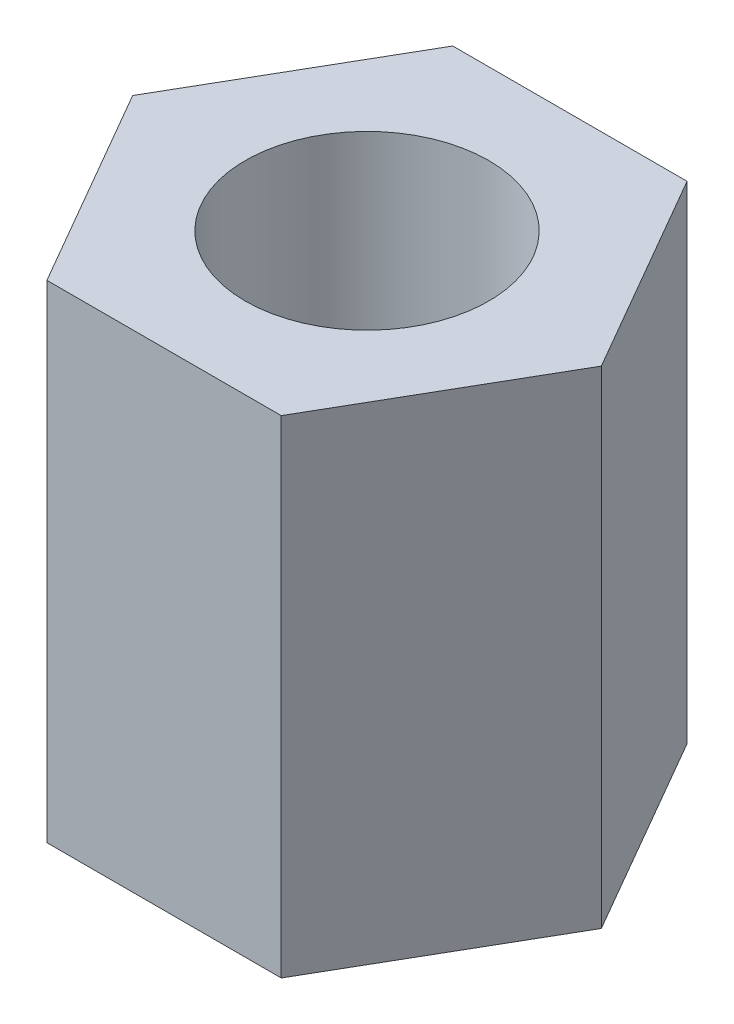
ISO-10303-21;
HEADER;
FILE_DESCRIPTION(('STEP AP214'),'2;1');
FILE_NAME('part.step','',(''),(''),'','','');
FILE_SCHEMA(('AUTOMOTIVE_DESIGN { 1 0 10303 214 1 1 1 1 }'));
ENDSEC;
DATA;
#1=APPLICATION_CONTEXT('core data for automotive mechanical design processes');
#2=APPLICATION_PROTOCOL_DEFINITION('international standard','automotive_design',2000,#1);
#3=PRODUCT_CONTEXT('',#1,'mechanical');
#4=PRODUCT('Part','Part','',(#3));
#5=PRODUCT_RELATED_PRODUCT_CATEGORY('part','',(#4));
#6=PRODUCT_DEFINITION_FORMATION('','',#4);
#7=PRODUCT_DEFINITION_CONTEXT('part definition',#1,'design');
#8=PRODUCT_DEFINITION('design','',#6,#7);
#9=PRODUCT_DEFINITION_SHAPE('','',#8);
#10=(LENGTH_UNIT() NAMED_UNIT(*) SI_UNIT(.MILLI.,.METRE.));
#11=(NAMED_UNIT(*) PLANE_ANGLE_UNIT() SI_UNIT($,.RADIAN.));
#12=(NAMED_UNIT(*) SI_UNIT($,.STERADIAN.) SOLID_ANGLE_UNIT());
#13=UNCERTAINTY_MEASURE_WITH_UNIT(LENGTH_MEASURE(1.E-05),#10,'distance_accuracy_value','');
#14=(GEOMETRIC_REPRESENTATION_CONTEXT(3) GLOBAL_UNCERTAINTY_ASSIGNED_CONTEXT((#13)) GLOBAL_UNIT_ASSIGNED_CONTEXT((#10,
#11,#12)) REPRESENTATION_CONTEXT('',''));
#15=CARTESIAN_POINT('',(0.,0.,0.));
#16=DIRECTION('',(0.,0.,1.));
#17=DIRECTION('',(1.,0.,0.));
#18=AXIS2_PLACEMENT_3D('',#15,#16,#17);
#19=CARTESIAN_POINT('',(0.,3.,0.));
#20=DIRECTION('',(0.,1.,0.));
#21=DIRECTION('',(0.,0.,1.));
#22=AXIS2_PLACEMENT_3D('',#19,#20,#21);
#23=PLANE('',#22);
#24=DIRECTION('',(1.,0.,0.));
#25=VECTOR('',#24,1.);
#26=CARTESIAN_POINT('',(-1.44337567297405,3.,2.5));
#27=LINE('',#26,#25);
#28=CARTESIAN_POINT('',(-1.44337567297405,3.,2.5));
#29=VERTEX_POINT('',#28);
#30=CARTESIAN_POINT('',(1.44337567297408,3.,2.5));
#31=VERTEX_POINT('',#30);
#32=EDGE_CURVE('E128',#29,#31,#27,.T.);
#33=ORIENTED_EDGE('',*,*,#32,.T.);
#34=DIRECTION('',(0.500000000000001,0.,-0.866025403784438));
#35=VECTOR('',#34,1.);
#36=CARTESIAN_POINT('',(1.44337567297408,3.,2.5));
#37=LINE('',#36,#35);
#38=CARTESIAN_POINT('',(2.88675134594815,3.,0.));
#39=VERTEX_POINT('',#38);
#40=EDGE_CURVE('E86',#31,#39,#37,.T.);
#41=ORIENTED_EDGE('',*,*,#40,.T.);
#42=DIRECTION('',(-0.500000000000001,0.,-0.866025403784438));
#43=VECTOR('',#42,1.);
#44=CARTESIAN_POINT('',(2.88675134594815,3.,0.));
#45=LINE('',#44,#43);
#46=CARTESIAN_POINT('',(1.44337567297408,3.,-2.50000000000001));
#47=VERTEX_POINT('',#46);
#48=EDGE_CURVE('E99',#39,#47,#45,.T.);
#49=ORIENTED_EDGE('',*,*,#48,.T.);
#50=DIRECTION('',(-1.,0.,0.));
#51=VECTOR('',#50,1.);
#52=CARTESIAN_POINT('',(1.44337567297408,3.,-2.50000000000001));
#53=LINE('',#52,#51);
#54=CARTESIAN_POINT('',(-1.44337567297405,3.,-2.50000000000001));
#55=VERTEX_POINT('',#54);
#56=EDGE_CURVE('E93',#47,#55,#53,.T.);
#57=ORIENTED_EDGE('',*,*,#56,.T.);
#58=DIRECTION('',(-0.5,0.,0.866025403784438));
#59=VECTOR('',#58,1.);
#60=CARTESIAN_POINT('',(-1.44337567297405,3.,-2.50000000000001));
#61=LINE('',#60,#59);
#62=CARTESIAN_POINT('',(-2.88675134594812,3.,0.));
#63=VERTEX_POINT('',#62);
#64=EDGE_CURVE('E97',#55,#63,#61,.T.);
#65=ORIENTED_EDGE('',*,*,#64,.T.);
#66=DIRECTION('',(0.5,0.,0.866025403784438));
#67=VECTOR('',#66,1.);
#68=CARTESIAN_POINT('',(-2.88675134594812,3.,0.));
#69=LINE('',#68,#67);
#70=EDGE_CURVE('E49',#63,#29,#69,.T.);
#71=ORIENTED_EDGE('',*,*,#70,.T.);
#72=EDGE_LOOP('',(#33,#41,#49,#57,#65,#71));
#73=FACE_BOUND('',#72,.T.);
#74=CARTESIAN_POINT('',(0.,3.,0.));
#75=DIRECTION('',(0.,1.,0.));
#76=DIRECTION('',(0.,0.,1.));
#77=AXIS2_PLACEMENT_3D('',#74,#75,#76);
#78=CIRCLE('',#77,1.5);
#79=CARTESIAN_POINT('',(0.,3.,1.5));
#80=VERTEX_POINT('',#79);
#81=EDGE_CURVE('E121',#80,#80,#78,.T.);
#82=ORIENTED_EDGE('',*,*,#81,.F.);
#83=EDGE_LOOP('',(#82));
#84=FACE_BOUND('',#83,.T.);
#85=ADVANCED_FACE('F32',(#73,#84),#23,.T.);
#86=CARTESIAN_POINT('',(0.,-3.,0.));
#87=DIRECTION('',(0.,1.,0.));
#88=DIRECTION('',(0.,0.,1.));
#89=AXIS2_PLACEMENT_3D('',#86,#87,#88);
#90=PLANE('',#89);
#91=DIRECTION('',(1.,0.,0.));
#92=VECTOR('',#91,1.);
#93=CARTESIAN_POINT('',(-1.44337567297405,-3.,2.5));
#94=LINE('',#93,#92);
#95=CARTESIAN_POINT('',(-1.44337567297405,-3.,2.5));
#96=VERTEX_POINT('',#95);
#97=CARTESIAN_POINT('',(1.44337567297408,-3.,2.5));
#98=VERTEX_POINT('',#97);
#99=EDGE_CURVE('E117',#96,#98,#94,.T.);
#100=ORIENTED_EDGE('',*,*,#99,.F.);
#101=DIRECTION('',(0.5,0.,0.866025403784438));
#102=VECTOR('',#101,1.);
#103=CARTESIAN_POINT('',(-2.88675134594812,-3.,0.));
#104=LINE('',#103,#102);
#105=CARTESIAN_POINT('',(-2.88675134594812,-3.,0.));
#106=VERTEX_POINT('',#105);
#107=EDGE_CURVE('E78',#106,#96,#104,.T.);
#108=ORIENTED_EDGE('',*,*,#107,.F.);
#109=DIRECTION('',(-0.5,0.,0.866025403784438));
#110=VECTOR('',#109,1.);
#111=CARTESIAN_POINT('',(-1.44337567297405,-3.,-2.50000000000001));
#112=LINE('',#111,#110);
#113=CARTESIAN_POINT('',(-1.44337567297405,-3.,-2.50000000000001));
#114=VERTEX_POINT('',#113);
#115=EDGE_CURVE('E72',#114,#106,#112,.T.);
#116=ORIENTED_EDGE('',*,*,#115,.F.);
#117=DIRECTION('',(-1.,0.,0.));
#118=VECTOR('',#117,1.);
#119=CARTESIAN_POINT('',(1.44337567297408,-3.,-2.50000000000001));
#120=LINE('',#119,#118);
#121=CARTESIAN_POINT('',(1.44337567297408,-3.,-2.50000000000001));
#122=VERTEX_POINT('',#121);
#123=EDGE_CURVE('E107',#122,#114,#120,.T.);
#124=ORIENTED_EDGE('',*,*,#123,.F.);
#125=DIRECTION('',(-0.500000000000001,0.,-0.866025403784438));
#126=VECTOR('',#125,1.);
#127=CARTESIAN_POINT('',(2.88675134594815,-3.,0.));
#128=LINE('',#127,#126);
#129=CARTESIAN_POINT('',(2.88675134594815,-3.,0.));
#130=VERTEX_POINT('',#129);
#131=EDGE_CURVE('E123',#130,#122,#128,.T.);
#132=ORIENTED_EDGE('',*,*,#131,.F.);
#133=DIRECTION('',(0.500000000000001,0.,-0.866025403784438));
#134=VECTOR('',#133,1.);
#135=CARTESIAN_POINT('',(1.44337567297408,-3.,2.5));
#136=LINE('',#135,#134);
#137=EDGE_CURVE('E120',#98,#130,#136,.T.);
#138=ORIENTED_EDGE('',*,*,#137,.F.);
#139=EDGE_LOOP('',(#100,#108,#116,#124,#132,#138));
#140=FACE_BOUND('',#139,.T.);
#141=CARTESIAN_POINT('',(0.,-3.,0.));
#142=DIRECTION('',(0.,1.,0.));
#143=DIRECTION('',(0.,0.,1.));
#144=AXIS2_PLACEMENT_3D('',#141,#142,#143);
#145=CIRCLE('',#144,1.5);
#146=CARTESIAN_POINT('',(0.,-3.,1.5));
#147=VERTEX_POINT('',#146);
#148=EDGE_CURVE('E221',#147,#147,#145,.T.);
#149=ORIENTED_EDGE('',*,*,#148,.T.);
#150=EDGE_LOOP('',(#149));
#151=FACE_BOUND('',#150,.T.);
#152=ADVANCED_FACE('F137',(#140,#151),#90,.F.);
#153=CARTESIAN_POINT('',(-1.44337567297405,3.,2.5));
#154=DIRECTION('',(0.,0.,-1.));
#155=DIRECTION('',(-1.,0.,0.));
#156=AXIS2_PLACEMENT_3D('',#153,#154,#155);
#157=PLANE('',#156);
#158=ORIENTED_EDGE('',*,*,#99,.T.);
#159=DIRECTION('',(0.,-1.,0.));
#160=VECTOR('',#159,1.);
#161=CARTESIAN_POINT('',(1.44337567297408,3.,2.5));
#162=LINE('',#161,#160);
#163=EDGE_CURVE('E11',#31,#98,#162,.T.);
#164=ORIENTED_EDGE('',*,*,#163,.F.);
#165=ORIENTED_EDGE('',*,*,#32,.F.);
#166=DIRECTION('',(0.,-1.,0.));
#167=VECTOR('',#166,1.);
#168=CARTESIAN_POINT('',(-1.44337567297405,3.,2.5));
#169=LINE('',#168,#167);
#170=EDGE_CURVE('E113',#29,#96,#169,.T.);
#171=ORIENTED_EDGE('',*,*,#170,.T.);
#172=EDGE_LOOP('',(#158,#164,#165,#171));
#173=FACE_BOUND('',#172,.T.);
#174=ADVANCED_FACE('F34',(#173),#157,.F.);
#175=CARTESIAN_POINT('',(1.44337567297408,3.,2.5));
#176=DIRECTION('',(-0.866025403784438,0.,-0.500000000000001));
#177=DIRECTION('',(-0.500000000000001,0.,0.866025403784438));
#178=AXIS2_PLACEMENT_3D('',#175,#176,#177);
#179=PLANE('',#178);
#180=ORIENTED_EDGE('',*,*,#137,.T.);
#181=DIRECTION('',(0.,-1.,0.));
#182=VECTOR('',#181,1.);
#183=CARTESIAN_POINT('',(2.88675134594815,3.,0.));
#184=LINE('',#183,#182);
#185=EDGE_CURVE('E41',#39,#130,#184,.T.);
#186=ORIENTED_EDGE('',*,*,#185,.F.);
#187=ORIENTED_EDGE('',*,*,#40,.F.);
#188=ORIENTED_EDGE('',*,*,#163,.T.);
#189=EDGE_LOOP('',(#180,#186,#187,#188));
#190=FACE_BOUND('',#189,.T.);
#191=ADVANCED_FACE('F162',(#190),#179,.F.);
#192=CARTESIAN_POINT('',(2.88675134594815,3.,0.));
#193=DIRECTION('',(-0.866025403784438,0.,0.500000000000001));
#194=DIRECTION('',(0.500000000000001,0.,0.866025403784438));
#195=AXIS2_PLACEMENT_3D('',#192,#193,#194);
#196=PLANE('',#195);
#197=ORIENTED_EDGE('',*,*,#131,.T.);
#198=DIRECTION('',(0.,-1.,0.));
#199=VECTOR('',#198,1.);
#200=CARTESIAN_POINT('',(1.44337567297408,3.,-2.50000000000001));
#201=LINE('',#200,#199);
#202=EDGE_CURVE('E108',#47,#122,#201,.T.);
#203=ORIENTED_EDGE('',*,*,#202,.F.);
#204=ORIENTED_EDGE('',*,*,#48,.F.);
#205=ORIENTED_EDGE('',*,*,#185,.T.);
#206=EDGE_LOOP('',(#197,#203,#204,#205));
#207=FACE_BOUND('',#206,.T.);
#208=ADVANCED_FACE('F134',(#207),#196,.F.);
#209=CARTESIAN_POINT('',(1.44337567297408,3.,-2.50000000000001));
#210=DIRECTION('',(0.,0.,1.));
#211=DIRECTION('',(1.,0.,0.));
#212=AXIS2_PLACEMENT_3D('',#209,#210,#211);
#213=PLANE('',#212);
#214=ORIENTED_EDGE('',*,*,#123,.T.);
#215=DIRECTION('',(0.,-1.,0.));
#216=VECTOR('',#215,1.);
#217=CARTESIAN_POINT('',(-1.44337567297405,3.,-2.50000000000001));
#218=LINE('',#217,#216);
#219=EDGE_CURVE('E104',#55,#114,#218,.T.);
#220=ORIENTED_EDGE('',*,*,#219,.F.);
#221=ORIENTED_EDGE('',*,*,#56,.F.);
#222=ORIENTED_EDGE('',*,*,#202,.T.);
#223=EDGE_LOOP('',(#214,#220,#221,#222));
#224=FACE_BOUND('',#223,.T.);
#225=ADVANCED_FACE('F105',(#224),#213,.F.);
#226=CARTESIAN_POINT('',(-1.44337567297405,3.,-2.50000000000001));
#227=DIRECTION('',(0.866025403784439,0.,0.5));
#228=DIRECTION('',(0.5,0.,-0.866025403784439));
#229=AXIS2_PLACEMENT_3D('',#226,#227,#228);
#230=PLANE('',#229);
#231=ORIENTED_EDGE('',*,*,#115,.T.);
#232=DIRECTION('',(0.,-1.,0.));
#233=VECTOR('',#232,1.);
#234=CARTESIAN_POINT('',(-2.88675134594812,3.,0.));
#235=LINE('',#234,#233);
#236=EDGE_CURVE('E109',#63,#106,#235,.T.);
#237=ORIENTED_EDGE('',*,*,#236,.F.);
#238=ORIENTED_EDGE('',*,*,#64,.F.);
#239=ORIENTED_EDGE('',*,*,#219,.T.);
#240=EDGE_LOOP('',(#231,#237,#238,#239));
#241=FACE_BOUND('',#240,.T.);
#242=ADVANCED_FACE('F111',(#241),#230,.F.);
#243=CARTESIAN_POINT('',(-2.88675134594812,3.,0.));
#244=DIRECTION('',(0.866025403784438,0.,-0.500000000000001));
#245=DIRECTION('',(-0.500000000000001,0.,-0.866025403784438));
#246=AXIS2_PLACEMENT_3D('',#243,#244,#245);
#247=PLANE('',#246);
#248=ORIENTED_EDGE('',*,*,#107,.T.);
#249=ORIENTED_EDGE('',*,*,#170,.F.);
#250=ORIENTED_EDGE('',*,*,#70,.F.);
#251=ORIENTED_EDGE('',*,*,#236,.T.);
#252=EDGE_LOOP('',(#248,#249,#250,#251));
#253=FACE_BOUND('',#252,.T.);
#254=ADVANCED_FACE('F142',(#253),#247,.F.);
#255=CARTESIAN_POINT('',(0.,3.,0.));
#256=DIRECTION('',(0.,-1.,0.));
#257=DIRECTION('',(0.,0.,-1.));
#258=AXIS2_PLACEMENT_3D('',#255,#256,#257);
#259=CYLINDRICAL_SURFACE('',#258,1.5);
#260=ORIENTED_EDGE('',*,*,#81,.T.);
#261=EDGE_LOOP('',(#260));
#262=FACE_BOUND('',#261,.T.);
#263=ORIENTED_EDGE('',*,*,#148,.F.);
#264=EDGE_LOOP('',(#263));
#265=FACE_BOUND('',#264,.T.);
#266=ADVANCED_FACE('F144',(#262,#265),#259,.F.);
#267=CLOSED_SHELL('',(#85,#152,#174,#191,#208,#225,#242,#254,#266));
#268=MANIFOLD_SOLID_BREP('B2',#267);
#269=ADVANCED_BREP_SHAPE_REPRESENTATION('',(#18,#268),#14);
#270=SHAPE_DEFINITION_REPRESENTATION(#9,#269);
ENDSEC;
END-ISO-10303-21;
